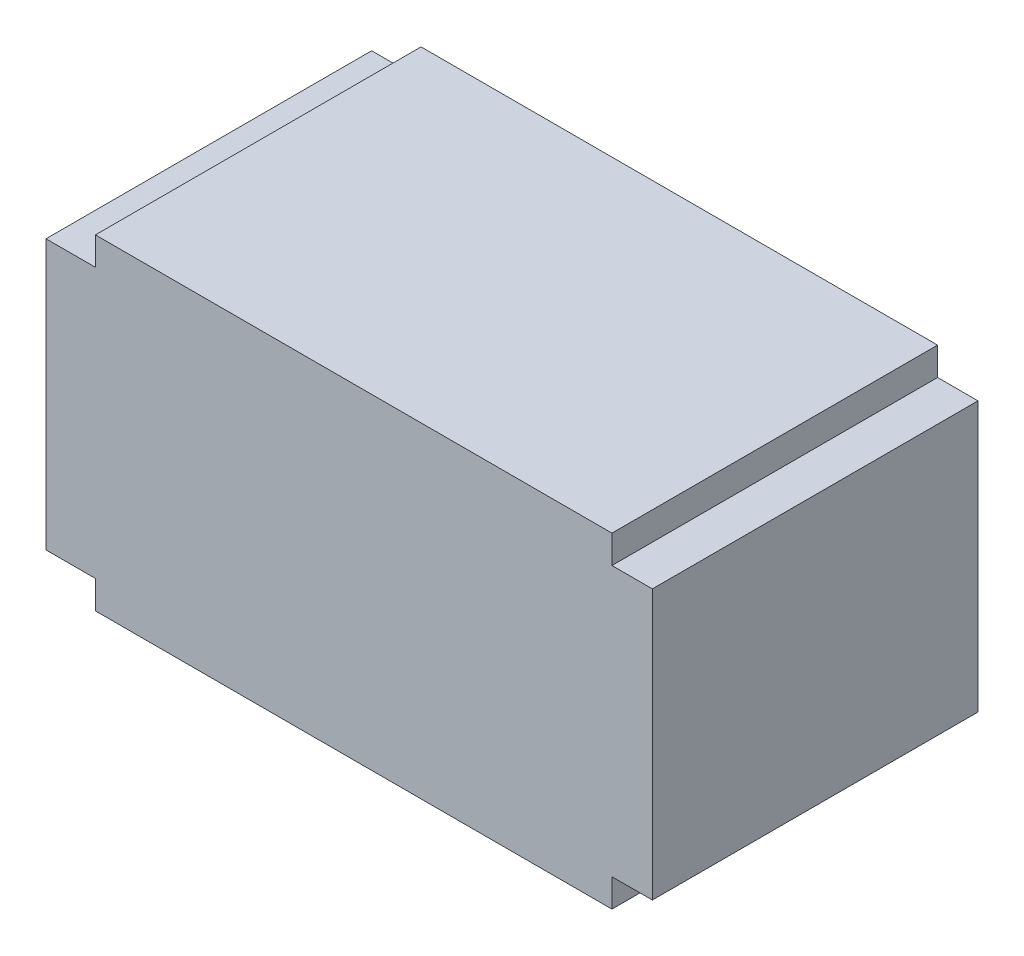
ISO-10303-21;
HEADER;
FILE_DESCRIPTION(('STEP AP214'),'2;1');
FILE_NAME('part.step','',(''),(''),'','','');
FILE_SCHEMA(('AUTOMOTIVE_DESIGN { 1 0 10303 214 1 1 1 1 }'));
ENDSEC;
DATA;
#1=APPLICATION_CONTEXT('core data for automotive mechanical design processes');
#2=APPLICATION_PROTOCOL_DEFINITION('international standard','automotive_design',2000,#1);
#3=PRODUCT_CONTEXT('',#1,'mechanical');
#4=PRODUCT('Part','Part','',(#3));
#5=PRODUCT_RELATED_PRODUCT_CATEGORY('part','',(#4));
#6=PRODUCT_DEFINITION_FORMATION('','',#4);
#7=PRODUCT_DEFINITION_CONTEXT('part definition',#1,'design');
#8=PRODUCT_DEFINITION('design','',#6,#7);
#9=PRODUCT_DEFINITION_SHAPE('','',#8);
#10=(LENGTH_UNIT() NAMED_UNIT(*) SI_UNIT(.MILLI.,.METRE.));
#11=(NAMED_UNIT(*) PLANE_ANGLE_UNIT() SI_UNIT($,.RADIAN.));
#12=(NAMED_UNIT(*) SI_UNIT($,.STERADIAN.) SOLID_ANGLE_UNIT());
#13=UNCERTAINTY_MEASURE_WITH_UNIT(LENGTH_MEASURE(1.E-05),#10,'distance_accuracy_value','');
#14=(GEOMETRIC_REPRESENTATION_CONTEXT(3) GLOBAL_UNCERTAINTY_ASSIGNED_CONTEXT((#13)) GLOBAL_UNIT_ASSIGNED_CONTEXT((#10,
#11,#12)) REPRESENTATION_CONTEXT('',''));
#15=CARTESIAN_POINT('',(0.,0.,0.));
#16=DIRECTION('',(0.,0.,1.));
#17=DIRECTION('',(1.,0.,0.));
#18=AXIS2_PLACEMENT_3D('',#15,#16,#17);
#19=CARTESIAN_POINT('',(1.35,0.6,1.45));
#20=DIRECTION('',(-1.,0.,0.));
#21=DIRECTION('',(0.,0.,1.));
#22=AXIS2_PLACEMENT_3D('',#19,#20,#21);
#23=PLANE('',#22);
#24=DIRECTION('',(0.,1.,0.));
#25=VECTOR('',#24,1.);
#26=CARTESIAN_POINT('',(1.35,0.6,0.));
#27=LINE('',#26,#25);
#28=CARTESIAN_POINT('',(1.35,-0.6,0.));
#29=VERTEX_POINT('',#28);
#30=CARTESIAN_POINT('',(1.35,0.6,0.));
#31=VERTEX_POINT('',#30);
#32=EDGE_CURVE('E154',#29,#31,#27,.T.);
#33=ORIENTED_EDGE('',*,*,#32,.T.);
#34=DIRECTION('',(0.,0.,-1.));
#35=VECTOR('',#34,1.);
#36=CARTESIAN_POINT('',(1.35,0.6,1.45));
#37=LINE('',#36,#35);
#38=CARTESIAN_POINT('',(1.35,0.6,1.45));
#39=VERTEX_POINT('',#38);
#40=EDGE_CURVE('E11',#39,#31,#37,.T.);
#41=ORIENTED_EDGE('',*,*,#40,.F.);
#42=DIRECTION('',(0.,1.,0.));
#43=VECTOR('',#42,1.);
#44=CARTESIAN_POINT('',(1.35,0.6,1.45));
#45=LINE('',#44,#43);
#46=CARTESIAN_POINT('',(1.35,-0.6,1.45));
#47=VERTEX_POINT('',#46);
#48=EDGE_CURVE('E176',#47,#39,#45,.T.);
#49=ORIENTED_EDGE('',*,*,#48,.F.);
#50=DIRECTION('',(0.,0.,-1.));
#51=VECTOR('',#50,1.);
#52=CARTESIAN_POINT('',(1.35,-0.6,1.45));
#53=LINE('',#52,#51);
#54=EDGE_CURVE('E150',#47,#29,#53,.T.);
#55=ORIENTED_EDGE('',*,*,#54,.T.);
#56=EDGE_LOOP('',(#33,#41,#49,#55));
#57=FACE_BOUND('',#56,.T.);
#58=ADVANCED_FACE('F34',(#57),#23,.F.);
#59=CARTESIAN_POINT('',(1.17,0.6,1.45));
#60=DIRECTION('',(0.,-1.,0.));
#61=DIRECTION('',(0.,0.,-1.));
#62=AXIS2_PLACEMENT_3D('',#59,#60,#61);
#63=PLANE('',#62);
#64=DIRECTION('',(-1.,0.,0.));
#65=VECTOR('',#64,1.);
#66=CARTESIAN_POINT('',(1.17,0.6,0.));
#67=LINE('',#66,#65);
#68=CARTESIAN_POINT('',(1.17,0.6,0.));
#69=VERTEX_POINT('',#68);
#70=EDGE_CURVE('E157',#31,#69,#67,.T.);
#71=ORIENTED_EDGE('',*,*,#70,.T.);
#72=DIRECTION('',(0.,0.,-1.));
#73=VECTOR('',#72,1.);
#74=CARTESIAN_POINT('',(1.17,0.6,1.45));
#75=LINE('',#74,#73);
#76=CARTESIAN_POINT('',(1.17,0.6,1.45));
#77=VERTEX_POINT('',#76);
#78=EDGE_CURVE('E42',#77,#69,#75,.T.);
#79=ORIENTED_EDGE('',*,*,#78,.F.);
#80=DIRECTION('',(-1.,0.,0.));
#81=VECTOR('',#80,1.);
#82=CARTESIAN_POINT('',(1.17,0.6,1.45));
#83=LINE('',#82,#81);
#84=EDGE_CURVE('E105',#39,#77,#83,.T.);
#85=ORIENTED_EDGE('',*,*,#84,.F.);
#86=ORIENTED_EDGE('',*,*,#40,.T.);
#87=EDGE_LOOP('',(#71,#79,#85,#86));
#88=FACE_BOUND('',#87,.T.);
#89=ADVANCED_FACE('F254',(#88),#63,.F.);
#90=CARTESIAN_POINT('',(1.17,0.725,1.45));
#91=DIRECTION('',(-1.,0.,0.));
#92=DIRECTION('',(0.,0.,1.));
#93=AXIS2_PLACEMENT_3D('',#90,#91,#92);
#94=PLANE('',#93);
#95=DIRECTION('',(0.,1.,0.));
#96=VECTOR('',#95,1.);
#97=CARTESIAN_POINT('',(1.17,0.725,0.));
#98=LINE('',#97,#96);
#99=CARTESIAN_POINT('',(1.17,0.725,0.));
#100=VERTEX_POINT('',#99);
#101=EDGE_CURVE('E159',#69,#100,#98,.T.);
#102=ORIENTED_EDGE('',*,*,#101,.T.);
#103=DIRECTION('',(0.,0.,-1.));
#104=VECTOR('',#103,1.);
#105=CARTESIAN_POINT('',(1.17,0.725,1.45));
#106=LINE('',#105,#104);
#107=CARTESIAN_POINT('',(1.17,0.725,1.45));
#108=VERTEX_POINT('',#107);
#109=EDGE_CURVE('E195',#108,#100,#106,.T.);
#110=ORIENTED_EDGE('',*,*,#109,.F.);
#111=DIRECTION('',(0.,1.,0.));
#112=VECTOR('',#111,1.);
#113=CARTESIAN_POINT('',(1.17,0.725,1.45));
#114=LINE('',#113,#112);
#115=EDGE_CURVE('E203',#77,#108,#114,.T.);
#116=ORIENTED_EDGE('',*,*,#115,.F.);
#117=ORIENTED_EDGE('',*,*,#78,.T.);
#118=EDGE_LOOP('',(#102,#110,#116,#117));
#119=FACE_BOUND('',#118,.T.);
#120=ADVANCED_FACE('F201',(#119),#94,.F.);
#121=CARTESIAN_POINT('',(-1.13,0.725,1.45));
#122=DIRECTION('',(0.,-1.,0.));
#123=DIRECTION('',(0.,0.,-1.));
#124=AXIS2_PLACEMENT_3D('',#121,#122,#123);
#125=PLANE('',#124);
#126=DIRECTION('',(-1.,0.,0.));
#127=VECTOR('',#126,1.);
#128=CARTESIAN_POINT('',(-1.13,0.725,0.));
#129=LINE('',#128,#127);
#130=CARTESIAN_POINT('',(-1.13,0.725,0.));
#131=VERTEX_POINT('',#130);
#132=EDGE_CURVE('E161',#100,#131,#129,.T.);
#133=ORIENTED_EDGE('',*,*,#132,.T.);
#134=DIRECTION('',(0.,0.,-1.));
#135=VECTOR('',#134,1.);
#136=CARTESIAN_POINT('',(-1.13,0.725,1.45));
#137=LINE('',#136,#135);
#138=CARTESIAN_POINT('',(-1.13,0.725,1.45));
#139=VERTEX_POINT('',#138);
#140=EDGE_CURVE('E192',#139,#131,#137,.T.);
#141=ORIENTED_EDGE('',*,*,#140,.F.);
#142=DIRECTION('',(-1.,0.,0.));
#143=VECTOR('',#142,1.);
#144=CARTESIAN_POINT('',(-1.13,0.725,1.45));
#145=LINE('',#144,#143);
#146=EDGE_CURVE('E221',#108,#139,#145,.T.);
#147=ORIENTED_EDGE('',*,*,#146,.F.);
#148=ORIENTED_EDGE('',*,*,#109,.T.);
#149=EDGE_LOOP('',(#133,#141,#147,#148));
#150=FACE_BOUND('',#149,.T.);
#151=ADVANCED_FACE('F212',(#150),#125,.F.);
#152=CARTESIAN_POINT('',(-1.13,0.6,1.45));
#153=DIRECTION('',(1.,0.,0.));
#154=DIRECTION('',(0.,0.,-1.));
#155=AXIS2_PLACEMENT_3D('',#152,#153,#154);
#156=PLANE('',#155);
#157=DIRECTION('',(0.,-1.,0.));
#158=VECTOR('',#157,1.);
#159=CARTESIAN_POINT('',(-1.13,0.6,0.));
#160=LINE('',#159,#158);
#161=CARTESIAN_POINT('',(-1.13,0.6,0.));
#162=VERTEX_POINT('',#161);
#163=EDGE_CURVE('E163',#131,#162,#160,.T.);
#164=ORIENTED_EDGE('',*,*,#163,.T.);
#165=DIRECTION('',(0.,0.,-1.));
#166=VECTOR('',#165,1.);
#167=CARTESIAN_POINT('',(-1.13,0.6,1.45));
#168=LINE('',#167,#166);
#169=CARTESIAN_POINT('',(-1.13,0.6,1.45));
#170=VERTEX_POINT('',#169);
#171=EDGE_CURVE('E189',#170,#162,#168,.T.);
#172=ORIENTED_EDGE('',*,*,#171,.F.);
#173=DIRECTION('',(0.,-1.,0.));
#174=VECTOR('',#173,1.);
#175=CARTESIAN_POINT('',(-1.13,0.6,1.45));
#176=LINE('',#175,#174);
#177=EDGE_CURVE('E218',#139,#170,#176,.T.);
#178=ORIENTED_EDGE('',*,*,#177,.F.);
#179=ORIENTED_EDGE('',*,*,#140,.T.);
#180=EDGE_LOOP('',(#164,#172,#178,#179));
#181=FACE_BOUND('',#180,.T.);
#182=ADVANCED_FACE('F216',(#181),#156,.F.);
#183=CARTESIAN_POINT('',(-1.35,0.6,1.45));
#184=DIRECTION('',(0.,-1.,0.));
#185=DIRECTION('',(0.,0.,-1.));
#186=AXIS2_PLACEMENT_3D('',#183,#184,#185);
#187=PLANE('',#186);
#188=DIRECTION('',(-1.,0.,0.));
#189=VECTOR('',#188,1.);
#190=CARTESIAN_POINT('',(-1.35,0.6,0.));
#191=LINE('',#190,#189);
#192=CARTESIAN_POINT('',(-1.35,0.6,0.));
#193=VERTEX_POINT('',#192);
#194=EDGE_CURVE('E165',#162,#193,#191,.T.);
#195=ORIENTED_EDGE('',*,*,#194,.T.);
#196=DIRECTION('',(0.,0.,-1.));
#197=VECTOR('',#196,1.);
#198=CARTESIAN_POINT('',(-1.35,0.6,1.45));
#199=LINE('',#198,#197);
#200=CARTESIAN_POINT('',(-1.35,0.6,1.45));
#201=VERTEX_POINT('',#200);
#202=EDGE_CURVE('E186',#201,#193,#199,.T.);
#203=ORIENTED_EDGE('',*,*,#202,.F.);
#204=DIRECTION('',(-1.,0.,0.));
#205=VECTOR('',#204,1.);
#206=CARTESIAN_POINT('',(-1.35,0.6,1.45));
#207=LINE('',#206,#205);
#208=EDGE_CURVE('E220',#170,#201,#207,.T.);
#209=ORIENTED_EDGE('',*,*,#208,.F.);
#210=ORIENTED_EDGE('',*,*,#171,.T.);
#211=EDGE_LOOP('',(#195,#203,#209,#210));
#212=FACE_BOUND('',#211,.T.);
#213=ADVANCED_FACE('F267',(#212),#187,.F.);
#214=CARTESIAN_POINT('',(-1.35,-0.6,1.45));
#215=DIRECTION('',(1.,0.,0.));
#216=DIRECTION('',(0.,0.,-1.));
#217=AXIS2_PLACEMENT_3D('',#214,#215,#216);
#218=PLANE('',#217);
#219=DIRECTION('',(0.,-1.,0.));
#220=VECTOR('',#219,1.);
#221=CARTESIAN_POINT('',(-1.35,-0.6,0.));
#222=LINE('',#221,#220);
#223=CARTESIAN_POINT('',(-1.35,-0.6,0.));
#224=VERTEX_POINT('',#223);
#225=EDGE_CURVE('E167',#193,#224,#222,.T.);
#226=ORIENTED_EDGE('',*,*,#225,.T.);
#227=DIRECTION('',(0.,0.,-1.));
#228=VECTOR('',#227,1.);
#229=CARTESIAN_POINT('',(-1.35,-0.6,1.45));
#230=LINE('',#229,#228);
#231=CARTESIAN_POINT('',(-1.35,-0.6,1.45));
#232=VERTEX_POINT('',#231);
#233=EDGE_CURVE('E183',#232,#224,#230,.T.);
#234=ORIENTED_EDGE('',*,*,#233,.F.);
#235=DIRECTION('',(0.,-1.,0.));
#236=VECTOR('',#235,1.);
#237=CARTESIAN_POINT('',(-1.35,-0.6,1.45));
#238=LINE('',#237,#236);
#239=EDGE_CURVE('E223',#201,#232,#238,.T.);
#240=ORIENTED_EDGE('',*,*,#239,.F.);
#241=ORIENTED_EDGE('',*,*,#202,.T.);
#242=EDGE_LOOP('',(#226,#234,#240,#241));
#243=FACE_BOUND('',#242,.T.);
#244=ADVANCED_FACE('F270',(#243),#218,.F.);
#245=CARTESIAN_POINT('',(-1.13,-0.6,1.45));
#246=DIRECTION('',(0.,1.,0.));
#247=DIRECTION('',(0.,0.,1.));
#248=AXIS2_PLACEMENT_3D('',#245,#246,#247);
#249=PLANE('',#248);
#250=DIRECTION('',(1.,0.,0.));
#251=VECTOR('',#250,1.);
#252=CARTESIAN_POINT('',(-1.13,-0.6,0.));
#253=LINE('',#252,#251);
#254=CARTESIAN_POINT('',(-1.13,-0.6,0.));
#255=VERTEX_POINT('',#254);
#256=EDGE_CURVE('E169',#224,#255,#253,.T.);
#257=ORIENTED_EDGE('',*,*,#256,.T.);
#258=DIRECTION('',(0.,0.,-1.));
#259=VECTOR('',#258,1.);
#260=CARTESIAN_POINT('',(-1.13,-0.6,1.45));
#261=LINE('',#260,#259);
#262=CARTESIAN_POINT('',(-1.13,-0.6,1.45));
#263=VERTEX_POINT('',#262);
#264=EDGE_CURVE('E180',#263,#255,#261,.T.);
#265=ORIENTED_EDGE('',*,*,#264,.F.);
#266=DIRECTION('',(1.,0.,0.));
#267=VECTOR('',#266,1.);
#268=CARTESIAN_POINT('',(-1.13,-0.6,1.45));
#269=LINE('',#268,#267);
#270=EDGE_CURVE('E229',#232,#263,#269,.T.);
#271=ORIENTED_EDGE('',*,*,#270,.F.);
#272=ORIENTED_EDGE('',*,*,#233,.T.);
#273=EDGE_LOOP('',(#257,#265,#271,#272));
#274=FACE_BOUND('',#273,.T.);
#275=ADVANCED_FACE('F235',(#274),#249,.F.);
#276=CARTESIAN_POINT('',(-1.13,-0.725,1.45));
#277=DIRECTION('',(1.,0.,0.));
#278=DIRECTION('',(0.,0.,-1.));
#279=AXIS2_PLACEMENT_3D('',#276,#277,#278);
#280=PLANE('',#279);
#281=DIRECTION('',(0.,-1.,0.));
#282=VECTOR('',#281,1.);
#283=CARTESIAN_POINT('',(-1.13,-0.725,0.));
#284=LINE('',#283,#282);
#285=CARTESIAN_POINT('',(-1.13,-0.725,0.));
#286=VERTEX_POINT('',#285);
#287=EDGE_CURVE('E171',#255,#286,#284,.T.);
#288=ORIENTED_EDGE('',*,*,#287,.T.);
#289=DIRECTION('',(0.,0.,-1.));
#290=VECTOR('',#289,1.);
#291=CARTESIAN_POINT('',(-1.13,-0.725,1.45));
#292=LINE('',#291,#290);
#293=CARTESIAN_POINT('',(-1.13,-0.725,1.45));
#294=VERTEX_POINT('',#293);
#295=EDGE_CURVE('E145',#294,#286,#292,.T.);
#296=ORIENTED_EDGE('',*,*,#295,.F.);
#297=DIRECTION('',(0.,-1.,0.));
#298=VECTOR('',#297,1.);
#299=CARTESIAN_POINT('',(-1.13,-0.725,1.45));
#300=LINE('',#299,#298);
#301=EDGE_CURVE('E136',#263,#294,#300,.T.);
#302=ORIENTED_EDGE('',*,*,#301,.F.);
#303=ORIENTED_EDGE('',*,*,#264,.T.);
#304=EDGE_LOOP('',(#288,#296,#302,#303));
#305=FACE_BOUND('',#304,.T.);
#306=ADVANCED_FACE('F239',(#305),#280,.F.);
#307=CARTESIAN_POINT('',(1.17,-0.725,1.45));
#308=DIRECTION('',(0.,1.,0.));
#309=DIRECTION('',(0.,0.,1.));
#310=AXIS2_PLACEMENT_3D('',#307,#308,#309);
#311=PLANE('',#310);
#312=DIRECTION('',(1.,0.,0.));
#313=VECTOR('',#312,1.);
#314=CARTESIAN_POINT('',(1.17,-0.725,0.));
#315=LINE('',#314,#313);
#316=CARTESIAN_POINT('',(1.17,-0.725,0.));
#317=VERTEX_POINT('',#316);
#318=EDGE_CURVE('E144',#286,#317,#315,.T.);
#319=ORIENTED_EDGE('',*,*,#318,.T.);
#320=DIRECTION('',(0.,0.,-1.));
#321=VECTOR('',#320,1.);
#322=CARTESIAN_POINT('',(1.17,-0.725,1.45));
#323=LINE('',#322,#321);
#324=CARTESIAN_POINT('',(1.17,-0.725,1.45));
#325=VERTEX_POINT('',#324);
#326=EDGE_CURVE('E141',#325,#317,#323,.T.);
#327=ORIENTED_EDGE('',*,*,#326,.F.);
#328=DIRECTION('',(1.,0.,0.));
#329=VECTOR('',#328,1.);
#330=CARTESIAN_POINT('',(1.17,-0.725,1.45));
#331=LINE('',#330,#329);
#332=EDGE_CURVE('E130',#294,#325,#331,.T.);
#333=ORIENTED_EDGE('',*,*,#332,.F.);
#334=ORIENTED_EDGE('',*,*,#295,.T.);
#335=EDGE_LOOP('',(#319,#327,#333,#334));
#336=FACE_BOUND('',#335,.T.);
#337=ADVANCED_FACE('F142',(#336),#311,.F.);
#338=CARTESIAN_POINT('',(1.17,-0.6,1.45));
#339=DIRECTION('',(-1.,0.,0.));
#340=DIRECTION('',(0.,0.,1.));
#341=AXIS2_PLACEMENT_3D('',#338,#339,#340);
#342=PLANE('',#341);
#343=DIRECTION('',(0.,1.,0.));
#344=VECTOR('',#343,1.);
#345=CARTESIAN_POINT('',(1.17,-0.6,0.));
#346=LINE('',#345,#344);
#347=CARTESIAN_POINT('',(1.17,-0.6,0.));
#348=VERTEX_POINT('',#347);
#349=EDGE_CURVE('E91',#317,#348,#346,.T.);
#350=ORIENTED_EDGE('',*,*,#349,.T.);
#351=DIRECTION('',(0.,0.,-1.));
#352=VECTOR('',#351,1.);
#353=CARTESIAN_POINT('',(1.17,-0.6,1.45));
#354=LINE('',#353,#352);
#355=CARTESIAN_POINT('',(1.17,-0.6,1.45));
#356=VERTEX_POINT('',#355);
#357=EDGE_CURVE('E146',#356,#348,#354,.T.);
#358=ORIENTED_EDGE('',*,*,#357,.F.);
#359=DIRECTION('',(0.,1.,0.));
#360=VECTOR('',#359,1.);
#361=CARTESIAN_POINT('',(1.17,-0.6,1.45));
#362=LINE('',#361,#360);
#363=EDGE_CURVE('E134',#325,#356,#362,.T.);
#364=ORIENTED_EDGE('',*,*,#363,.F.);
#365=ORIENTED_EDGE('',*,*,#326,.T.);
#366=EDGE_LOOP('',(#350,#358,#364,#365));
#367=FACE_BOUND('',#366,.T.);
#368=ADVANCED_FACE('F148',(#367),#342,.F.);
#369=CARTESIAN_POINT('',(1.35,-0.6,1.45));
#370=DIRECTION('',(0.,1.,0.));
#371=DIRECTION('',(0.,0.,1.));
#372=AXIS2_PLACEMENT_3D('',#369,#370,#371);
#373=PLANE('',#372);
#374=DIRECTION('',(1.,0.,0.));
#375=VECTOR('',#374,1.);
#376=CARTESIAN_POINT('',(1.35,-0.6,0.));
#377=LINE('',#376,#375);
#378=EDGE_CURVE('E97',#348,#29,#377,.T.);
#379=ORIENTED_EDGE('',*,*,#378,.T.);
#380=ORIENTED_EDGE('',*,*,#54,.F.);
#381=DIRECTION('',(1.,0.,0.));
#382=VECTOR('',#381,1.);
#383=CARTESIAN_POINT('',(1.35,-0.6,1.45));
#384=LINE('',#383,#382);
#385=EDGE_CURVE('E50',#356,#47,#384,.T.);
#386=ORIENTED_EDGE('',*,*,#385,.F.);
#387=ORIENTED_EDGE('',*,*,#357,.T.);
#388=EDGE_LOOP('',(#379,#380,#386,#387));
#389=FACE_BOUND('',#388,.T.);
#390=ADVANCED_FACE('F243',(#389),#373,.F.);
#391=CARTESIAN_POINT('',(0.,0.,1.45));
#392=DIRECTION('',(0.,0.,-1.));
#393=DIRECTION('',(-1.,0.,0.));
#394=AXIS2_PLACEMENT_3D('',#391,#392,#393);
#395=PLANE('',#394);
#396=ORIENTED_EDGE('',*,*,#48,.T.);
#397=ORIENTED_EDGE('',*,*,#84,.T.);
#398=ORIENTED_EDGE('',*,*,#115,.T.);
#399=ORIENTED_EDGE('',*,*,#146,.T.);
#400=ORIENTED_EDGE('',*,*,#177,.T.);
#401=ORIENTED_EDGE('',*,*,#208,.T.);
#402=ORIENTED_EDGE('',*,*,#239,.T.);
#403=ORIENTED_EDGE('',*,*,#270,.T.);
#404=ORIENTED_EDGE('',*,*,#301,.T.);
#405=ORIENTED_EDGE('',*,*,#332,.T.);
#406=ORIENTED_EDGE('',*,*,#363,.T.);
#407=ORIENTED_EDGE('',*,*,#385,.T.);
#408=EDGE_LOOP('',(#396,#397,#398,#399,#400,#401,#402,#403,#404,#405,#406,#407));
#409=FACE_BOUND('',#408,.T.);
#410=ADVANCED_FACE('F132',(#409),#395,.F.);
#411=CARTESIAN_POINT('',(0.,0.,0.));
#412=DIRECTION('',(0.,0.,-1.));
#413=DIRECTION('',(-1.,0.,0.));
#414=AXIS2_PLACEMENT_3D('',#411,#412,#413);
#415=PLANE('',#414);
#416=ORIENTED_EDGE('',*,*,#32,.F.);
#417=ORIENTED_EDGE('',*,*,#378,.F.);
#418=ORIENTED_EDGE('',*,*,#349,.F.);
#419=ORIENTED_EDGE('',*,*,#318,.F.);
#420=ORIENTED_EDGE('',*,*,#287,.F.);
#421=ORIENTED_EDGE('',*,*,#256,.F.);
#422=ORIENTED_EDGE('',*,*,#225,.F.);
#423=ORIENTED_EDGE('',*,*,#194,.F.);
#424=ORIENTED_EDGE('',*,*,#163,.F.);
#425=ORIENTED_EDGE('',*,*,#132,.F.);
#426=ORIENTED_EDGE('',*,*,#101,.F.);
#427=ORIENTED_EDGE('',*,*,#70,.F.);
#428=EDGE_LOOP('',(#416,#417,#418,#419,#420,#421,#422,#423,#424,#425,#426,#427));
#429=FACE_BOUND('',#428,.T.);
#430=ADVANCED_FACE('F207',(#429),#415,.T.);
#431=CLOSED_SHELL('',(#58,#89,#120,#151,#182,#213,#244,#275,#306,#337,#368,#390,#410,#430));
#432=MANIFOLD_SOLID_BREP('B2',#431);
#433=ADVANCED_BREP_SHAPE_REPRESENTATION('',(#18,#432),#14);
#434=SHAPE_DEFINITION_REPRESENTATION(#9,#433);
ENDSEC;
END-ISO-10303-21;
